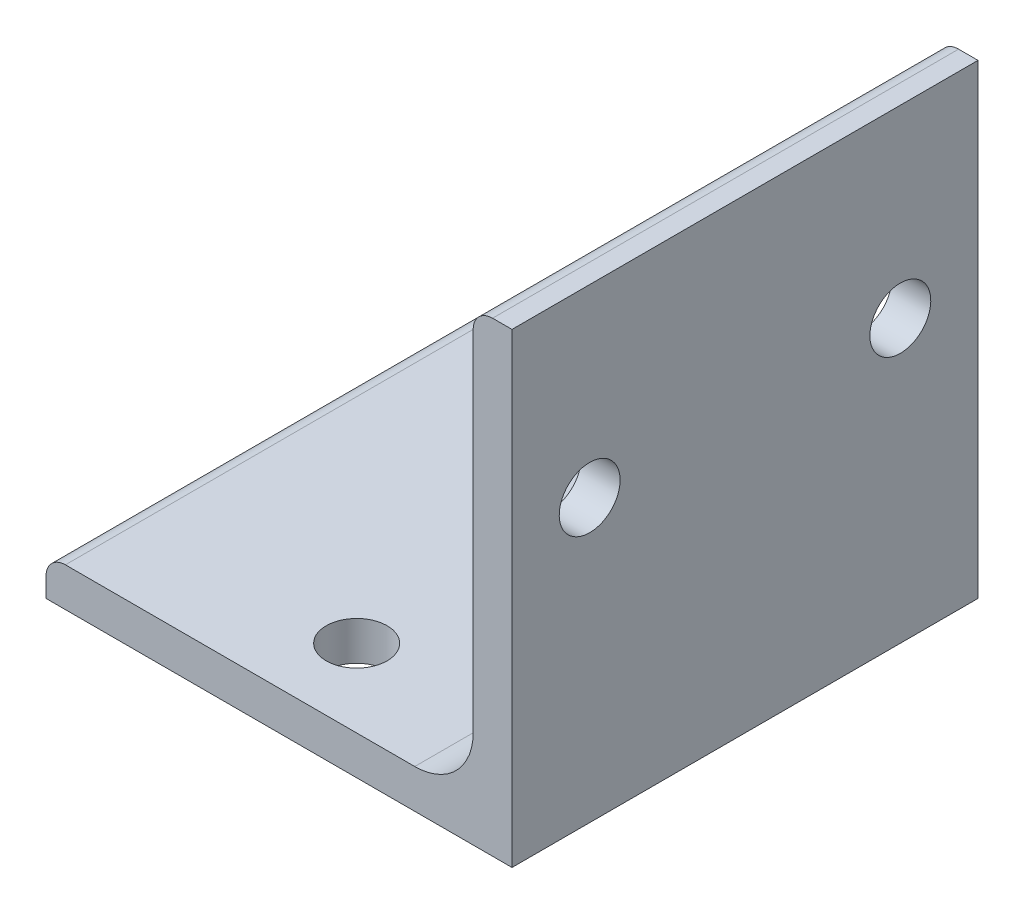
ISO-10303-21;
HEADER;
FILE_DESCRIPTION(('STEP AP214'),'2;1');
FILE_NAME('part.step','',(''),(''),'','','');
FILE_SCHEMA(('AUTOMOTIVE_DESIGN { 1 0 10303 214 1 1 1 1 }'));
ENDSEC;
DATA;
#1=APPLICATION_CONTEXT('core data for automotive mechanical design processes');
#2=APPLICATION_PROTOCOL_DEFINITION('international standard','automotive_design',2000,#1);
#3=PRODUCT_CONTEXT('',#1,'mechanical');
#4=PRODUCT('Part','Part','',(#3));
#5=PRODUCT_RELATED_PRODUCT_CATEGORY('part','',(#4));
#6=PRODUCT_DEFINITION_FORMATION('','',#4);
#7=PRODUCT_DEFINITION_CONTEXT('part definition',#1,'design');
#8=PRODUCT_DEFINITION('design','',#6,#7);
#9=PRODUCT_DEFINITION_SHAPE('','',#8);
#10=(LENGTH_UNIT() NAMED_UNIT(*) SI_UNIT(.MILLI.,.METRE.));
#11=(NAMED_UNIT(*) PLANE_ANGLE_UNIT() SI_UNIT($,.RADIAN.));
#12=(NAMED_UNIT(*) SI_UNIT($,.STERADIAN.) SOLID_ANGLE_UNIT());
#13=UNCERTAINTY_MEASURE_WITH_UNIT(LENGTH_MEASURE(1.E-05),#10,'distance_accuracy_value','');
#14=(GEOMETRIC_REPRESENTATION_CONTEXT(3) GLOBAL_UNCERTAINTY_ASSIGNED_CONTEXT((#13)) GLOBAL_UNIT_ASSIGNED_CONTEXT((#10,
#11,#12)) REPRESENTATION_CONTEXT('',''));
#15=CARTESIAN_POINT('',(0.,0.,0.));
#16=DIRECTION('',(0.,0.,1.));
#17=DIRECTION('',(1.,0.,0.));
#18=AXIS2_PLACEMENT_3D('',#15,#16,#17);
#19=CARTESIAN_POINT('',(-19.05,-17.4625,19.05));
#20=DIRECTION('',(1.,0.,0.));
#21=DIRECTION('',(0.,0.,-1.));
#22=AXIS2_PLACEMENT_3D('',#19,#20,#21);
#23=PLANE('',#22);
#24=DIRECTION('',(0.,-1.,0.));
#25=VECTOR('',#24,1.);
#26=CARTESIAN_POINT('',(-19.05,-17.4625,-19.05));
#27=LINE('',#26,#25);
#28=CARTESIAN_POINT('',(-19.05,-17.4625,-19.05));
#29=VERTEX_POINT('',#28);
#30=CARTESIAN_POINT('',(-19.05,-19.05,-19.05));
#31=VERTEX_POINT('',#30);
#32=EDGE_CURVE('E153',#29,#31,#27,.T.);
#33=ORIENTED_EDGE('',*,*,#32,.T.);
#34=DIRECTION('',(0.,0.,-1.));
#35=VECTOR('',#34,1.);
#36=CARTESIAN_POINT('',(-19.05,-19.05,19.05));
#37=LINE('',#36,#35);
#38=CARTESIAN_POINT('',(-19.05,-19.05,19.05));
#39=VERTEX_POINT('',#38);
#40=EDGE_CURVE('E11',#39,#31,#37,.T.);
#41=ORIENTED_EDGE('',*,*,#40,.F.);
#42=DIRECTION('',(0.,-1.,0.));
#43=VECTOR('',#42,1.);
#44=CARTESIAN_POINT('',(-19.05,-17.4625,19.05));
#45=LINE('',#44,#43);
#46=CARTESIAN_POINT('',(-19.05,-17.4625,19.05));
#47=VERTEX_POINT('',#46);
#48=EDGE_CURVE('E179',#47,#39,#45,.T.);
#49=ORIENTED_EDGE('',*,*,#48,.F.);
#50=DIRECTION('',(0.,0.,-1.));
#51=VECTOR('',#50,1.);
#52=CARTESIAN_POINT('',(-19.05,-17.4625,19.05));
#53=LINE('',#52,#51);
#54=EDGE_CURVE('E149',#47,#29,#53,.T.);
#55=ORIENTED_EDGE('',*,*,#54,.T.);
#56=EDGE_LOOP('',(#33,#41,#49,#55));
#57=FACE_BOUND('',#56,.T.);
#58=ADVANCED_FACE('F44',(#57),#23,.F.);
#59=CARTESIAN_POINT('',(-19.05,-19.05,19.05));
#60=DIRECTION('',(0.,1.,0.));
#61=DIRECTION('',(-1.,0.,0.));
#62=AXIS2_PLACEMENT_3D('',#59,#60,#61);
#63=PLANE('',#62);
#64=CARTESIAN_POINT('',(0.,-19.05,-12.7));
#65=DIRECTION('',(0.,-1.,0.));
#66=DIRECTION('',(1.,0.,0.));
#67=AXIS2_PLACEMENT_3D('',#64,#65,#66);
#68=CIRCLE('',#67,2.4892);
#69=CARTESIAN_POINT('',(2.4892,-19.05,-12.7));
#70=VERTEX_POINT('',#69);
#71=EDGE_CURVE('E211',#70,#70,#68,.T.);
#72=ORIENTED_EDGE('',*,*,#71,.F.);
#73=EDGE_LOOP('',(#72));
#74=FACE_BOUND('',#73,.T.);
#75=CARTESIAN_POINT('',(0.,-19.05,12.7));
#76=DIRECTION('',(0.,-1.,0.));
#77=DIRECTION('',(1.,0.,0.));
#78=AXIS2_PLACEMENT_3D('',#75,#76,#77);
#79=CIRCLE('',#78,2.4892);
#80=CARTESIAN_POINT('',(2.4892,-19.05,12.7));
#81=VERTEX_POINT('',#80);
#82=EDGE_CURVE('E219',#81,#81,#79,.T.);
#83=ORIENTED_EDGE('',*,*,#82,.F.);
#84=EDGE_LOOP('',(#83));
#85=FACE_BOUND('',#84,.T.);
#86=DIRECTION('',(1.,0.,0.));
#87=VECTOR('',#86,1.);
#88=CARTESIAN_POINT('',(-19.05,-19.05,-19.05));
#89=LINE('',#88,#87);
#90=CARTESIAN_POINT('',(19.05,-19.05,-19.05));
#91=VERTEX_POINT('',#90);
#92=EDGE_CURVE('E157',#31,#91,#89,.T.);
#93=ORIENTED_EDGE('',*,*,#92,.T.);
#94=DIRECTION('',(0.,0.,-1.));
#95=VECTOR('',#94,1.);
#96=CARTESIAN_POINT('',(19.05,-19.05,19.05));
#97=LINE('',#96,#95);
#98=CARTESIAN_POINT('',(19.05,-19.05,19.05));
#99=VERTEX_POINT('',#98);
#100=EDGE_CURVE('E54',#99,#91,#97,.T.);
#101=ORIENTED_EDGE('',*,*,#100,.F.);
#102=DIRECTION('',(1.,0.,0.));
#103=VECTOR('',#102,1.);
#104=CARTESIAN_POINT('',(-19.05,-19.05,19.05));
#105=LINE('',#104,#103);
#106=EDGE_CURVE('E109',#39,#99,#105,.T.);
#107=ORIENTED_EDGE('',*,*,#106,.F.);
#108=ORIENTED_EDGE('',*,*,#40,.T.);
#109=EDGE_LOOP('',(#93,#101,#107,#108));
#110=FACE_BOUND('',#109,.T.);
#111=ADVANCED_FACE('F275',(#74,#85,#110),#63,.F.);
#112=CARTESIAN_POINT('',(19.05,-19.05,19.05));
#113=DIRECTION('',(-1.,0.,0.));
#114=DIRECTION('',(0.,-1.,0.));
#115=AXIS2_PLACEMENT_3D('',#112,#113,#114);
#116=PLANE('',#115);
#117=CARTESIAN_POINT('',(19.05,3.96875,12.7));
#118=DIRECTION('',(1.,0.,0.));
#119=DIRECTION('',(0.,1.,0.));
#120=AXIS2_PLACEMENT_3D('',#117,#118,#119);
#121=CIRCLE('',#120,2.4892);
#122=CARTESIAN_POINT('',(19.05,6.45795,12.7));
#123=VERTEX_POINT('',#122);
#124=EDGE_CURVE('E205',#123,#123,#121,.T.);
#125=ORIENTED_EDGE('',*,*,#124,.F.);
#126=EDGE_LOOP('',(#125));
#127=FACE_BOUND('',#126,.T.);
#128=CARTESIAN_POINT('',(19.05,3.96875,-12.7));
#129=DIRECTION('',(1.,0.,0.));
#130=DIRECTION('',(0.,1.,0.));
#131=AXIS2_PLACEMENT_3D('',#128,#129,#130);
#132=CIRCLE('',#131,2.4892);
#133=CARTESIAN_POINT('',(19.05,6.45795,-12.7));
#134=VERTEX_POINT('',#133);
#135=EDGE_CURVE('E217',#134,#134,#132,.T.);
#136=ORIENTED_EDGE('',*,*,#135,.F.);
#137=EDGE_LOOP('',(#136));
#138=FACE_BOUND('',#137,.T.);
#139=DIRECTION('',(0.,1.,0.));
#140=VECTOR('',#139,1.);
#141=CARTESIAN_POINT('',(19.05,-19.05,-19.05));
#142=LINE('',#141,#140);
#143=CARTESIAN_POINT('',(19.05,19.05,-19.05));
#144=VERTEX_POINT('',#143);
#145=EDGE_CURVE('E161',#91,#144,#142,.T.);
#146=ORIENTED_EDGE('',*,*,#145,.T.);
#147=DIRECTION('',(0.,0.,-1.));
#148=VECTOR('',#147,1.);
#149=CARTESIAN_POINT('',(19.05,19.05,19.05));
#150=LINE('',#149,#148);
#151=CARTESIAN_POINT('',(19.05,19.05,19.05));
#152=VERTEX_POINT('',#151);
#153=EDGE_CURVE('E194',#152,#144,#150,.T.);
#154=ORIENTED_EDGE('',*,*,#153,.F.);
#155=DIRECTION('',(0.,1.,0.));
#156=VECTOR('',#155,1.);
#157=CARTESIAN_POINT('',(19.05,-19.05,19.05));
#158=LINE('',#157,#156);
#159=EDGE_CURVE('E237',#99,#152,#158,.T.);
#160=ORIENTED_EDGE('',*,*,#159,.F.);
#161=ORIENTED_EDGE('',*,*,#100,.T.);
#162=EDGE_LOOP('',(#146,#154,#160,#161));
#163=FACE_BOUND('',#162,.T.);
#164=ADVANCED_FACE('F279',(#127,#138,#163),#116,.F.);
#165=CARTESIAN_POINT('',(17.4625,19.05,19.05));
#166=DIRECTION('',(0.,-1.,0.));
#167=DIRECTION('',(1.,0.,0.));
#168=AXIS2_PLACEMENT_3D('',#165,#166,#167);
#169=PLANE('',#168);
#170=DIRECTION('',(-1.,0.,0.));
#171=VECTOR('',#170,1.);
#172=CARTESIAN_POINT('',(17.4625,19.05,-19.05));
#173=LINE('',#172,#171);
#174=CARTESIAN_POINT('',(17.4625,19.05,-19.05));
#175=VERTEX_POINT('',#174);
#176=EDGE_CURVE('E164',#144,#175,#173,.T.);
#177=ORIENTED_EDGE('',*,*,#176,.T.);
#178=DIRECTION('',(0.,0.,-1.));
#179=VECTOR('',#178,1.);
#180=CARTESIAN_POINT('',(17.4625,19.05,19.05));
#181=LINE('',#180,#179);
#182=CARTESIAN_POINT('',(17.4625,19.05,19.05));
#183=VERTEX_POINT('',#182);
#184=EDGE_CURVE('E190',#183,#175,#181,.T.);
#185=ORIENTED_EDGE('',*,*,#184,.F.);
#186=DIRECTION('',(-1.,0.,0.));
#187=VECTOR('',#186,1.);
#188=CARTESIAN_POINT('',(17.4625,19.05,19.05));
#189=LINE('',#188,#187);
#190=EDGE_CURVE('E240',#152,#183,#189,.T.);
#191=ORIENTED_EDGE('',*,*,#190,.F.);
#192=ORIENTED_EDGE('',*,*,#153,.T.);
#193=EDGE_LOOP('',(#177,#185,#191,#192));
#194=FACE_BOUND('',#193,.T.);
#195=ADVANCED_FACE('F284',(#194),#169,.F.);
#196=CARTESIAN_POINT('',(17.4625,17.4625,19.05));
#197=DIRECTION('',(0.,0.,-1.));
#198=DIRECTION('',(-1.,0.,0.));
#199=AXIS2_PLACEMENT_3D('',#196,#197,#198);
#200=CYLINDRICAL_SURFACE('',#199,1.5875);
#201=CARTESIAN_POINT('',(17.4625,17.4625,-19.05));
#202=DIRECTION('',(0.,0.,1.));
#203=DIRECTION('',(-1.,0.,0.));
#204=AXIS2_PLACEMENT_3D('',#201,#202,#203);
#205=CIRCLE('',#204,1.5875);
#206=CARTESIAN_POINT('',(15.875,17.4625,-19.05));
#207=VERTEX_POINT('',#206);
#208=EDGE_CURVE('E167',#175,#207,#205,.T.);
#209=ORIENTED_EDGE('',*,*,#208,.T.);
#210=DIRECTION('',(0.,0.,-1.));
#211=VECTOR('',#210,1.);
#212=CARTESIAN_POINT('',(15.875,17.4625,19.05));
#213=LINE('',#212,#211);
#214=CARTESIAN_POINT('',(15.875,17.4625,19.05));
#215=VERTEX_POINT('',#214);
#216=EDGE_CURVE('E186',#215,#207,#213,.T.);
#217=ORIENTED_EDGE('',*,*,#216,.F.);
#218=CARTESIAN_POINT('',(17.4625,17.4625,19.05));
#219=DIRECTION('',(0.,0.,1.));
#220=DIRECTION('',(-1.,0.,0.));
#221=AXIS2_PLACEMENT_3D('',#218,#219,#220);
#222=CIRCLE('',#221,1.5875);
#223=EDGE_CURVE('E243',#183,#215,#222,.T.);
#224=ORIENTED_EDGE('',*,*,#223,.F.);
#225=ORIENTED_EDGE('',*,*,#184,.T.);
#226=EDGE_LOOP('',(#209,#217,#224,#225));
#227=FACE_BOUND('',#226,.T.);
#228=ADVANCED_FACE('F251',(#227),#200,.T.);
#229=CARTESIAN_POINT('',(15.875,17.4625,19.05));
#230=DIRECTION('',(1.,0.,0.));
#231=DIRECTION('',(0.,1.,0.));
#232=AXIS2_PLACEMENT_3D('',#229,#230,#231);
#233=PLANE('',#232);
#234=CARTESIAN_POINT('',(15.875,3.96875,12.7));
#235=DIRECTION('',(1.,0.,0.));
#236=DIRECTION('',(0.,1.,0.));
#237=AXIS2_PLACEMENT_3D('',#234,#235,#236);
#238=CIRCLE('',#237,2.4892);
#239=CARTESIAN_POINT('',(15.875,6.45795,12.7));
#240=VERTEX_POINT('',#239);
#241=EDGE_CURVE('E158',#240,#240,#238,.T.);
#242=ORIENTED_EDGE('',*,*,#241,.T.);
#243=EDGE_LOOP('',(#242));
#244=FACE_BOUND('',#243,.T.);
#245=CARTESIAN_POINT('',(15.875,3.96875,-12.7));
#246=DIRECTION('',(1.,0.,0.));
#247=DIRECTION('',(0.,1.,0.));
#248=AXIS2_PLACEMENT_3D('',#245,#246,#247);
#249=CIRCLE('',#248,2.4892);
#250=CARTESIAN_POINT('',(15.875,6.45795,-12.7));
#251=VERTEX_POINT('',#250);
#252=EDGE_CURVE('E201',#251,#251,#249,.T.);
#253=ORIENTED_EDGE('',*,*,#252,.T.);
#254=EDGE_LOOP('',(#253));
#255=FACE_BOUND('',#254,.T.);
#256=DIRECTION('',(0.,-1.,0.));
#257=VECTOR('',#256,1.);
#258=CARTESIAN_POINT('',(15.875,17.4625,-19.05));
#259=LINE('',#258,#257);
#260=CARTESIAN_POINT('',(15.875,-11.0998,-19.05));
#261=VERTEX_POINT('',#260);
#262=EDGE_CURVE('E170',#207,#261,#259,.T.);
#263=ORIENTED_EDGE('',*,*,#262,.T.);
#264=DIRECTION('',(0.,0.,-1.));
#265=VECTOR('',#264,1.);
#266=CARTESIAN_POINT('',(15.875,-11.0998,19.05));
#267=LINE('',#266,#265);
#268=CARTESIAN_POINT('',(15.875,-11.0998,19.05));
#269=VERTEX_POINT('',#268);
#270=EDGE_CURVE('E142',#269,#261,#267,.T.);
#271=ORIENTED_EDGE('',*,*,#270,.F.);
#272=DIRECTION('',(0.,-1.,0.));
#273=VECTOR('',#272,1.);
#274=CARTESIAN_POINT('',(15.875,17.4625,19.05));
#275=LINE('',#274,#273);
#276=EDGE_CURVE('E131',#215,#269,#275,.T.);
#277=ORIENTED_EDGE('',*,*,#276,.F.);
#278=ORIENTED_EDGE('',*,*,#216,.T.);
#279=EDGE_LOOP('',(#263,#271,#277,#278));
#280=FACE_BOUND('',#279,.T.);
#281=ADVANCED_FACE('F255',(#244,#255,#280),#233,.F.);
#282=CARTESIAN_POINT('',(11.0998,-11.0998,19.05));
#283=DIRECTION('',(0.,0.,-1.));
#284=DIRECTION('',(-1.,0.,0.));
#285=AXIS2_PLACEMENT_3D('',#282,#283,#284);
#286=CYLINDRICAL_SURFACE('',#285,4.7752);
#287=CARTESIAN_POINT('',(11.0998,-11.0998,-19.05));
#288=DIRECTION('',(0.,0.,-1.));
#289=DIRECTION('',(-1.,0.,0.));
#290=AXIS2_PLACEMENT_3D('',#287,#288,#289);
#291=CIRCLE('',#290,4.7752);
#292=CARTESIAN_POINT('',(11.0998,-15.875,-19.05));
#293=VERTEX_POINT('',#292);
#294=EDGE_CURVE('E140',#261,#293,#291,.T.);
#295=ORIENTED_EDGE('',*,*,#294,.T.);
#296=DIRECTION('',(0.,0.,-1.));
#297=VECTOR('',#296,1.);
#298=CARTESIAN_POINT('',(11.0998,-15.875,19.05));
#299=LINE('',#298,#297);
#300=CARTESIAN_POINT('',(11.0998,-15.875,19.05));
#301=VERTEX_POINT('',#300);
#302=EDGE_CURVE('E137',#301,#293,#299,.T.);
#303=ORIENTED_EDGE('',*,*,#302,.F.);
#304=CARTESIAN_POINT('',(11.0998,-11.0998,19.05));
#305=DIRECTION('',(0.,0.,-1.));
#306=DIRECTION('',(-1.,0.,0.));
#307=AXIS2_PLACEMENT_3D('',#304,#305,#306);
#308=CIRCLE('',#307,4.7752);
#309=EDGE_CURVE('E125',#269,#301,#308,.T.);
#310=ORIENTED_EDGE('',*,*,#309,.F.);
#311=ORIENTED_EDGE('',*,*,#270,.T.);
#312=EDGE_LOOP('',(#295,#303,#310,#311));
#313=FACE_BOUND('',#312,.T.);
#314=ADVANCED_FACE('F138',(#313),#286,.F.);
#315=CARTESIAN_POINT('',(11.0998,-15.875,19.05));
#316=DIRECTION('',(0.,-1.,0.));
#317=DIRECTION('',(1.,0.,0.));
#318=AXIS2_PLACEMENT_3D('',#315,#316,#317);
#319=PLANE('',#318);
#320=CARTESIAN_POINT('',(0.,-15.875,-12.7));
#321=DIRECTION('',(0.,-1.,0.));
#322=DIRECTION('',(1.,0.,0.));
#323=AXIS2_PLACEMENT_3D('',#320,#321,#322);
#324=CIRCLE('',#323,2.4892);
#325=CARTESIAN_POINT('',(2.4892,-15.875,-12.7));
#326=VERTEX_POINT('',#325);
#327=EDGE_CURVE('E47',#326,#326,#324,.T.);
#328=ORIENTED_EDGE('',*,*,#327,.T.);
#329=EDGE_LOOP('',(#328));
#330=FACE_BOUND('',#329,.T.);
#331=CARTESIAN_POINT('',(0.,-15.875,12.7));
#332=DIRECTION('',(0.,-1.,0.));
#333=DIRECTION('',(1.,0.,0.));
#334=AXIS2_PLACEMENT_3D('',#331,#332,#333);
#335=CIRCLE('',#334,2.4892);
#336=CARTESIAN_POINT('',(2.4892,-15.875,12.7));
#337=VERTEX_POINT('',#336);
#338=EDGE_CURVE('E208',#337,#337,#335,.T.);
#339=ORIENTED_EDGE('',*,*,#338,.T.);
#340=EDGE_LOOP('',(#339));
#341=FACE_BOUND('',#340,.T.);
#342=DIRECTION('',(-1.,0.,0.));
#343=VECTOR('',#342,1.);
#344=CARTESIAN_POINT('',(11.0998,-15.875,-19.05));
#345=LINE('',#344,#343);
#346=CARTESIAN_POINT('',(-17.4625,-15.875,-19.05));
#347=VERTEX_POINT('',#346);
#348=EDGE_CURVE('E95',#293,#347,#345,.T.);
#349=ORIENTED_EDGE('',*,*,#348,.T.);
#350=DIRECTION('',(0.,0.,-1.));
#351=VECTOR('',#350,1.);
#352=CARTESIAN_POINT('',(-17.4625,-15.875,19.05));
#353=LINE('',#352,#351);
#354=CARTESIAN_POINT('',(-17.4625,-15.875,19.05));
#355=VERTEX_POINT('',#354);
#356=EDGE_CURVE('E143',#355,#347,#353,.T.);
#357=ORIENTED_EDGE('',*,*,#356,.F.);
#358=DIRECTION('',(-1.,0.,0.));
#359=VECTOR('',#358,1.);
#360=CARTESIAN_POINT('',(11.0998,-15.875,19.05));
#361=LINE('',#360,#359);
#362=EDGE_CURVE('E129',#301,#355,#361,.T.);
#363=ORIENTED_EDGE('',*,*,#362,.F.);
#364=ORIENTED_EDGE('',*,*,#302,.T.);
#365=EDGE_LOOP('',(#349,#357,#363,#364));
#366=FACE_BOUND('',#365,.T.);
#367=ADVANCED_FACE('F145',(#330,#341,#366),#319,.F.);
#368=CARTESIAN_POINT('',(-17.4625,-17.4625,19.05));
#369=DIRECTION('',(0.,0.,-1.));
#370=DIRECTION('',(-1.,0.,0.));
#371=AXIS2_PLACEMENT_3D('',#368,#369,#370);
#372=CYLINDRICAL_SURFACE('',#371,1.5875);
#373=CARTESIAN_POINT('',(-17.4625,-17.4625,-19.05));
#374=DIRECTION('',(0.,0.,1.));
#375=DIRECTION('',(-1.,0.,0.));
#376=AXIS2_PLACEMENT_3D('',#373,#374,#375);
#377=CIRCLE('',#376,1.5875);
#378=EDGE_CURVE('E101',#347,#29,#377,.T.);
#379=ORIENTED_EDGE('',*,*,#378,.T.);
#380=ORIENTED_EDGE('',*,*,#54,.F.);
#381=CARTESIAN_POINT('',(-17.4625,-17.4625,19.05));
#382=DIRECTION('',(0.,0.,1.));
#383=DIRECTION('',(-1.,0.,0.));
#384=AXIS2_PLACEMENT_3D('',#381,#382,#383);
#385=CIRCLE('',#384,1.5875);
#386=EDGE_CURVE('E63',#355,#47,#385,.T.);
#387=ORIENTED_EDGE('',*,*,#386,.F.);
#388=ORIENTED_EDGE('',*,*,#356,.T.);
#389=EDGE_LOOP('',(#379,#380,#387,#388));
#390=FACE_BOUND('',#389,.T.);
#391=ADVANCED_FACE('F263',(#390),#372,.T.);
#392=CARTESIAN_POINT('',(17.4625,17.4625,19.05));
#393=DIRECTION('',(0.,0.,-1.));
#394=DIRECTION('',(-1.,0.,0.));
#395=AXIS2_PLACEMENT_3D('',#392,#393,#394);
#396=PLANE('',#395);
#397=ORIENTED_EDGE('',*,*,#48,.T.);
#398=ORIENTED_EDGE('',*,*,#106,.T.);
#399=ORIENTED_EDGE('',*,*,#159,.T.);
#400=ORIENTED_EDGE('',*,*,#190,.T.);
#401=ORIENTED_EDGE('',*,*,#223,.T.);
#402=ORIENTED_EDGE('',*,*,#276,.T.);
#403=ORIENTED_EDGE('',*,*,#309,.T.);
#404=ORIENTED_EDGE('',*,*,#362,.T.);
#405=ORIENTED_EDGE('',*,*,#386,.T.);
#406=EDGE_LOOP('',(#397,#398,#399,#400,#401,#402,#403,#404,#405));
#407=FACE_BOUND('',#406,.T.);
#408=ADVANCED_FACE('F127',(#407),#396,.F.);
#409=CARTESIAN_POINT('',(17.4625,17.4625,-19.05));
#410=DIRECTION('',(0.,0.,-1.));
#411=DIRECTION('',(-1.,0.,0.));
#412=AXIS2_PLACEMENT_3D('',#409,#410,#411);
#413=PLANE('',#412);
#414=ORIENTED_EDGE('',*,*,#32,.F.);
#415=ORIENTED_EDGE('',*,*,#378,.F.);
#416=ORIENTED_EDGE('',*,*,#348,.F.);
#417=ORIENTED_EDGE('',*,*,#294,.F.);
#418=ORIENTED_EDGE('',*,*,#262,.F.);
#419=ORIENTED_EDGE('',*,*,#208,.F.);
#420=ORIENTED_EDGE('',*,*,#176,.F.);
#421=ORIENTED_EDGE('',*,*,#145,.F.);
#422=ORIENTED_EDGE('',*,*,#92,.F.);
#423=EDGE_LOOP('',(#414,#415,#416,#417,#418,#419,#420,#421,#422));
#424=FACE_BOUND('',#423,.T.);
#425=ADVANCED_FACE('F258',(#424),#413,.T.);
#426=CARTESIAN_POINT('',(-19.05,3.96874999999999,-12.7));
#427=DIRECTION('',(1.,0.,0.));
#428=DIRECTION('',(0.,1.,0.));
#429=AXIS2_PLACEMENT_3D('',#426,#427,#428);
#430=CYLINDRICAL_SURFACE('',#429,2.4892);
#431=CARTESIAN_POINT('',(19.05,6.45795,-12.7));
#432=CARTESIAN_POINT('',(19.0169270833333,6.45795,-12.7));
#433=CARTESIAN_POINT('',(18.9838541666667,6.45795,-12.7));
#434=CARTESIAN_POINT('',(18.9177083333333,6.45795,-12.7));
#435=CARTESIAN_POINT('',(18.8846354166667,6.45795,-12.7));
#436=CARTESIAN_POINT('',(18.8184895833333,6.45795,-12.7));
#437=CARTESIAN_POINT('',(18.7854166666667,6.45795,-12.7));
#438=CARTESIAN_POINT('',(18.7192708333333,6.45795,-12.7));
#439=CARTESIAN_POINT('',(18.6861979166667,6.45795,-12.7));
#440=CARTESIAN_POINT('',(18.6200520833333,6.45795,-12.7));
#441=CARTESIAN_POINT('',(18.5869791666667,6.45795,-12.7));
#442=CARTESIAN_POINT('',(18.5208333333333,6.45795,-12.7));
#443=CARTESIAN_POINT('',(18.4877604166667,6.45795,-12.7));
#444=CARTESIAN_POINT('',(18.4216145833333,6.45795,-12.7));
#445=CARTESIAN_POINT('',(18.3885416666667,6.45795,-12.7));
#446=CARTESIAN_POINT('',(18.3223958333333,6.45795,-12.7));
#447=CARTESIAN_POINT('',(18.2893229166667,6.45795,-12.7));
#448=CARTESIAN_POINT('',(18.2231770833333,6.45795,-12.7));
#449=CARTESIAN_POINT('',(18.1901041666667,6.45795,-12.7));
#450=CARTESIAN_POINT('',(18.1239583333333,6.45795,-12.7));
#451=CARTESIAN_POINT('',(18.0908854166667,6.45795,-12.7));
#452=CARTESIAN_POINT('',(18.0247395833333,6.45795,-12.7));
#453=CARTESIAN_POINT('',(17.9916666666667,6.45795,-12.7));
#454=CARTESIAN_POINT('',(17.9255208333333,6.45795,-12.7));
#455=CARTESIAN_POINT('',(17.8924479166667,6.45795,-12.7));
#456=CARTESIAN_POINT('',(17.8263020833333,6.45795,-12.7));
#457=CARTESIAN_POINT('',(17.7932291666667,6.45795,-12.7));
#458=CARTESIAN_POINT('',(17.7270833333333,6.45795,-12.7));
#459=CARTESIAN_POINT('',(17.6940104166667,6.45795,-12.7));
#460=CARTESIAN_POINT('',(17.6278645833333,6.45795,-12.7));
#461=CARTESIAN_POINT('',(17.5947916666667,6.45795,-12.7));
#462=CARTESIAN_POINT('',(17.5286458333333,6.45795,-12.7));
#463=CARTESIAN_POINT('',(17.4955729166667,6.45795,-12.7));
#464=CARTESIAN_POINT('',(17.4294270833333,6.45795,-12.7));
#465=CARTESIAN_POINT('',(17.3963541666667,6.45795,-12.7));
#466=CARTESIAN_POINT('',(17.3302083333333,6.45795,-12.7));
#467=CARTESIAN_POINT('',(17.2971354166667,6.45795,-12.7));
#468=CARTESIAN_POINT('',(17.2309895833333,6.45795,-12.7));
#469=CARTESIAN_POINT('',(17.1979166666667,6.45795,-12.7));
#470=CARTESIAN_POINT('',(17.1317708333333,6.45795,-12.7));
#471=CARTESIAN_POINT('',(17.0986979166667,6.45795,-12.7));
#472=CARTESIAN_POINT('',(17.0325520833333,6.45795,-12.7));
#473=CARTESIAN_POINT('',(16.9994791666667,6.45795,-12.7));
#474=CARTESIAN_POINT('',(16.9333333333333,6.45795,-12.7));
#475=CARTESIAN_POINT('',(16.9002604166667,6.45795,-12.7));
#476=CARTESIAN_POINT('',(16.8341145833333,6.45795,-12.7));
#477=CARTESIAN_POINT('',(16.8010416666667,6.45795,-12.7));
#478=CARTESIAN_POINT('',(16.7348958333333,6.45795,-12.7));
#479=CARTESIAN_POINT('',(16.7018229166667,6.45795,-12.7));
#480=CARTESIAN_POINT('',(16.6356770833333,6.45795,-12.7));
#481=CARTESIAN_POINT('',(16.6026041666667,6.45795,-12.7));
#482=CARTESIAN_POINT('',(16.5364583333333,6.45795,-12.7));
#483=CARTESIAN_POINT('',(16.5033854166667,6.45795,-12.7));
#484=CARTESIAN_POINT('',(16.4372395833333,6.45795,-12.7));
#485=CARTESIAN_POINT('',(16.4041666666667,6.45795,-12.7));
#486=CARTESIAN_POINT('',(16.3380208333333,6.45795,-12.7));
#487=CARTESIAN_POINT('',(16.3049479166667,6.45795,-12.7));
#488=CARTESIAN_POINT('',(16.2388020833333,6.45795,-12.7));
#489=CARTESIAN_POINT('',(16.2057291666667,6.45795,-12.7));
#490=CARTESIAN_POINT('',(16.1395833333333,6.45795,-12.7));
#491=CARTESIAN_POINT('',(16.1065104166667,6.45795,-12.7));
#492=CARTESIAN_POINT('',(16.0403645833333,6.45795,-12.7));
#493=CARTESIAN_POINT('',(16.0072916666667,6.45795,-12.7));
#494=CARTESIAN_POINT('',(15.9411458333333,6.45795,-12.7));
#495=CARTESIAN_POINT('',(15.9080729166667,6.45795,-12.7));
#496=CARTESIAN_POINT('',(15.875,6.45795,-12.7));
#497=B_SPLINE_CURVE_WITH_KNOTS('',3,(#431,#432,#433,#434,#435,#436,#437,#438,#439,#440,#441,
#442,#443,#444,#445,#446,#447,#448,#449,#450,#451,#452,#453,#454,#455,#456,#457,#458,#459,#460,
#461,#462,#463,#464,#465,#466,#467,#468,#469,#470,#471,#472,#473,#474,#475,#476,#477,#478,#479,
#480,#481,#482,#483,#484,#485,#486,#487,#488,#489,#490,#491,#492,#493,#494,#495,#496),
.UNSPECIFIED.,.F.,.F.,(4,2,2,2,2,2,2,2,2,2,2,2,2,2,2,2,2,2,2,2,2,2,2,2,2,2,2,2,2,2,2,2,4),(0.,
0.0992187499999977,0.198437500000002,0.29765625,0.396874999999998,0.496093750000003,0.5953125,
0.694531249999998,0.793749999999996,0.892968750000001,0.992187499999998,1.09140625,1.190625,
1.28984375,1.3890625,1.48828125,1.5875,1.68671875,1.7859375,1.88515625,1.984375,2.08359375,
2.1828125,2.28203125,2.38125,2.48046875,2.5796875,2.67890624999999,2.778125,2.87734375,
2.97656249999999,3.07578125,3.175),.UNSPECIFIED.);
#498=EDGE_CURVE('BSEAM345',#134,#251,#497,.T.);
#499=ORIENTED_EDGE('',*,*,#135,.T.);
#500=ORIENTED_EDGE('',*,*,#252,.F.);
#501=ORIENTED_EDGE('',*,*,#498,.T.);
#502=ORIENTED_EDGE('',*,*,#498,.F.);
#503=EDGE_LOOP('',(#499,#501,#500,#502));
#504=FACE_BOUND('',#503,.T.);
#505=ADVANCED_FACE('F345',(#504),#430,.F.);
#506=CARTESIAN_POINT('',(-19.05,3.96874999999999,12.7));
#507=DIRECTION('',(1.,0.,0.));
#508=DIRECTION('',(0.,1.,0.));
#509=AXIS2_PLACEMENT_3D('',#506,#507,#508);
#510=CYLINDRICAL_SURFACE('',#509,2.4892);
#511=CARTESIAN_POINT('',(19.05,6.45795,12.7));
#512=CARTESIAN_POINT('',(19.0169270833333,6.45795,12.7));
#513=CARTESIAN_POINT('',(18.9838541666667,6.45795,12.7));
#514=CARTESIAN_POINT('',(18.9177083333333,6.45795,12.7));
#515=CARTESIAN_POINT('',(18.8846354166667,6.45795,12.7));
#516=CARTESIAN_POINT('',(18.8184895833333,6.45795,12.7));
#517=CARTESIAN_POINT('',(18.7854166666667,6.45795,12.7));
#518=CARTESIAN_POINT('',(18.7192708333333,6.45795,12.7));
#519=CARTESIAN_POINT('',(18.6861979166667,6.45795,12.7));
#520=CARTESIAN_POINT('',(18.6200520833333,6.45795,12.7));
#521=CARTESIAN_POINT('',(18.5869791666667,6.45795,12.7));
#522=CARTESIAN_POINT('',(18.5208333333333,6.45795,12.7));
#523=CARTESIAN_POINT('',(18.4877604166667,6.45795,12.7));
#524=CARTESIAN_POINT('',(18.4216145833333,6.45795,12.7));
#525=CARTESIAN_POINT('',(18.3885416666667,6.45795,12.7));
#526=CARTESIAN_POINT('',(18.3223958333333,6.45795,12.7));
#527=CARTESIAN_POINT('',(18.2893229166667,6.45795,12.7));
#528=CARTESIAN_POINT('',(18.2231770833333,6.45795,12.7));
#529=CARTESIAN_POINT('',(18.1901041666667,6.45795,12.7));
#530=CARTESIAN_POINT('',(18.1239583333333,6.45795,12.7));
#531=CARTESIAN_POINT('',(18.0908854166667,6.45795,12.7));
#532=CARTESIAN_POINT('',(18.0247395833333,6.45795,12.7));
#533=CARTESIAN_POINT('',(17.9916666666667,6.45795,12.7));
#534=CARTESIAN_POINT('',(17.9255208333333,6.45795,12.7));
#535=CARTESIAN_POINT('',(17.8924479166667,6.45795,12.7));
#536=CARTESIAN_POINT('',(17.8263020833333,6.45795,12.7));
#537=CARTESIAN_POINT('',(17.7932291666667,6.45795,12.7));
#538=CARTESIAN_POINT('',(17.7270833333333,6.45795,12.7));
#539=CARTESIAN_POINT('',(17.6940104166667,6.45795,12.7));
#540=CARTESIAN_POINT('',(17.6278645833333,6.45795,12.7));
#541=CARTESIAN_POINT('',(17.5947916666667,6.45795,12.7));
#542=CARTESIAN_POINT('',(17.5286458333333,6.45795,12.7));
#543=CARTESIAN_POINT('',(17.4955729166667,6.45795,12.7));
#544=CARTESIAN_POINT('',(17.4294270833333,6.45795,12.7));
#545=CARTESIAN_POINT('',(17.3963541666667,6.45795,12.7));
#546=CARTESIAN_POINT('',(17.3302083333333,6.45795,12.7));
#547=CARTESIAN_POINT('',(17.2971354166667,6.45795,12.7));
#548=CARTESIAN_POINT('',(17.2309895833333,6.45795,12.7));
#549=CARTESIAN_POINT('',(17.1979166666667,6.45795,12.7));
#550=CARTESIAN_POINT('',(17.1317708333333,6.45795,12.7));
#551=CARTESIAN_POINT('',(17.0986979166667,6.45795,12.7));
#552=CARTESIAN_POINT('',(17.0325520833333,6.45795,12.7));
#553=CARTESIAN_POINT('',(16.9994791666667,6.45795,12.7));
#554=CARTESIAN_POINT('',(16.9333333333333,6.45795,12.7));
#555=CARTESIAN_POINT('',(16.9002604166667,6.45795,12.7));
#556=CARTESIAN_POINT('',(16.8341145833333,6.45795,12.7));
#557=CARTESIAN_POINT('',(16.8010416666667,6.45795,12.7));
#558=CARTESIAN_POINT('',(16.7348958333333,6.45795,12.7));
#559=CARTESIAN_POINT('',(16.7018229166667,6.45795,12.7));
#560=CARTESIAN_POINT('',(16.6356770833333,6.45795,12.7));
#561=CARTESIAN_POINT('',(16.6026041666667,6.45795,12.7));
#562=CARTESIAN_POINT('',(16.5364583333333,6.45795,12.7));
#563=CARTESIAN_POINT('',(16.5033854166667,6.45795,12.7));
#564=CARTESIAN_POINT('',(16.4372395833333,6.45795,12.7));
#565=CARTESIAN_POINT('',(16.4041666666667,6.45795,12.7));
#566=CARTESIAN_POINT('',(16.3380208333333,6.45795,12.7));
#567=CARTESIAN_POINT('',(16.3049479166667,6.45795,12.7));
#568=CARTESIAN_POINT('',(16.2388020833333,6.45795,12.7));
#569=CARTESIAN_POINT('',(16.2057291666667,6.45795,12.7));
#570=CARTESIAN_POINT('',(16.1395833333333,6.45795,12.7));
#571=CARTESIAN_POINT('',(16.1065104166667,6.45795,12.7));
#572=CARTESIAN_POINT('',(16.0403645833333,6.45795,12.7));
#573=CARTESIAN_POINT('',(16.0072916666667,6.45795,12.7));
#574=CARTESIAN_POINT('',(15.9411458333333,6.45795,12.7));
#575=CARTESIAN_POINT('',(15.9080729166667,6.45795,12.7));
#576=CARTESIAN_POINT('',(15.875,6.45795,12.7));
#577=B_SPLINE_CURVE_WITH_KNOTS('',3,(#511,#512,#513,#514,#515,#516,#517,#518,#519,#520,#521,
#522,#523,#524,#525,#526,#527,#528,#529,#530,#531,#532,#533,#534,#535,#536,#537,#538,#539,#540,
#541,#542,#543,#544,#545,#546,#547,#548,#549,#550,#551,#552,#553,#554,#555,#556,#557,#558,#559,
#560,#561,#562,#563,#564,#565,#566,#567,#568,#569,#570,#571,#572,#573,#574,#575,#576),
.UNSPECIFIED.,.F.,.F.,(4,2,2,2,2,2,2,2,2,2,2,2,2,2,2,2,2,2,2,2,2,2,2,2,2,2,2,2,2,2,2,2,4),(0.,
0.0992187499999977,0.198437500000002,0.29765625,0.396874999999998,0.496093750000003,0.5953125,
0.694531249999998,0.793749999999996,0.892968750000001,0.992187499999998,1.09140625,1.190625,
1.28984375,1.3890625,1.48828125,1.5875,1.68671875,1.7859375,1.88515625,1.984375,2.08359375,
2.1828125,2.28203125,2.38125,2.48046875,2.5796875,2.67890624999999,2.778125,2.87734375,
2.97656249999999,3.07578125,3.175),.UNSPECIFIED.);
#578=EDGE_CURVE('BSEAM323',#123,#240,#577,.T.);
#579=ORIENTED_EDGE('',*,*,#124,.T.);
#580=ORIENTED_EDGE('',*,*,#241,.F.);
#581=ORIENTED_EDGE('',*,*,#578,.T.);
#582=ORIENTED_EDGE('',*,*,#578,.F.);
#583=EDGE_LOOP('',(#579,#581,#580,#582));
#584=FACE_BOUND('',#583,.T.);
#585=ADVANCED_FACE('F323',(#584),#510,.F.);
#586=CARTESIAN_POINT('',(0.,19.05,12.7));
#587=DIRECTION('',(0.,-1.,0.));
#588=DIRECTION('',(1.,0.,0.));
#589=AXIS2_PLACEMENT_3D('',#586,#587,#588);
#590=CYLINDRICAL_SURFACE('',#589,2.4892);
#591=ORIENTED_EDGE('',*,*,#82,.T.);
#592=EDGE_LOOP('',(#591));
#593=FACE_BOUND('',#592,.T.);
#594=ORIENTED_EDGE('',*,*,#338,.F.);
#595=EDGE_LOOP('',(#594));
#596=FACE_BOUND('',#595,.T.);
#597=ADVANCED_FACE('F317',(#593,#596),#590,.F.);
#598=CARTESIAN_POINT('',(0.,19.05,-12.7));
#599=DIRECTION('',(0.,-1.,0.));
#600=DIRECTION('',(1.,0.,0.));
#601=AXIS2_PLACEMENT_3D('',#598,#599,#600);
#602=CYLINDRICAL_SURFACE('',#601,2.4892);
#603=ORIENTED_EDGE('',*,*,#71,.T.);
#604=EDGE_LOOP('',(#603));
#605=FACE_BOUND('',#604,.T.);
#606=ORIENTED_EDGE('',*,*,#327,.F.);
#607=EDGE_LOOP('',(#606));
#608=FACE_BOUND('',#607,.T.);
#609=ADVANCED_FACE('F322',(#605,#608),#602,.F.);
#610=CLOSED_SHELL('',(#58,#111,#164,#195,#228,#281,#314,#367,#391,#408,#425,#505,#585,#597,#609));
#611=MANIFOLD_SOLID_BREP('B2',#610);
#612=ADVANCED_BREP_SHAPE_REPRESENTATION('',(#18,#611),#14);
#613=SHAPE_DEFINITION_REPRESENTATION(#9,#612);
ENDSEC;
END-ISO-10303-21;
